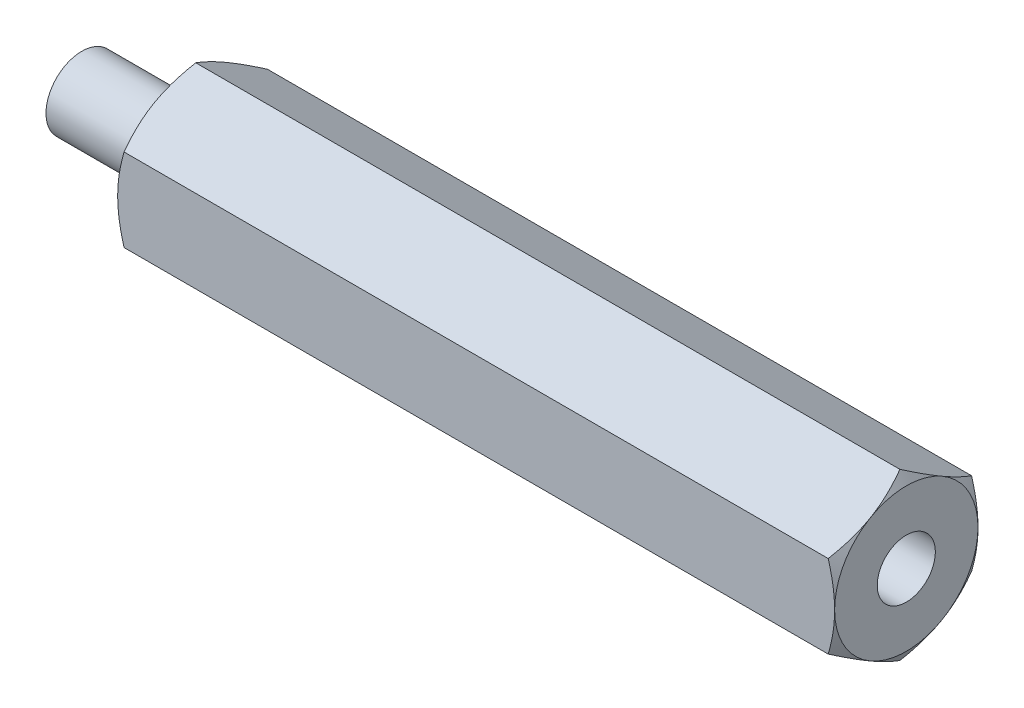
ISO-10303-21;
HEADER;
FILE_DESCRIPTION(('STEP AP214'),'2;1');
FILE_NAME('part.step','',(''),(''),'','','');
FILE_SCHEMA(('AUTOMOTIVE_DESIGN { 1 0 10303 214 1 1 1 1 }'));
ENDSEC;
DATA;
#1=APPLICATION_CONTEXT('core data for automotive mechanical design processes');
#2=APPLICATION_PROTOCOL_DEFINITION('international standard','automotive_design',2000,#1);
#3=PRODUCT_CONTEXT('',#1,'mechanical');
#4=PRODUCT('Part','Part','',(#3));
#5=PRODUCT_RELATED_PRODUCT_CATEGORY('part','',(#4));
#6=PRODUCT_DEFINITION_FORMATION('','',#4);
#7=PRODUCT_DEFINITION_CONTEXT('part definition',#1,'design');
#8=PRODUCT_DEFINITION('design','',#6,#7);
#9=PRODUCT_DEFINITION_SHAPE('','',#8);
#10=(LENGTH_UNIT() NAMED_UNIT(*) SI_UNIT(.MILLI.,.METRE.));
#11=(NAMED_UNIT(*) PLANE_ANGLE_UNIT() SI_UNIT($,.RADIAN.));
#12=(NAMED_UNIT(*) SI_UNIT($,.STERADIAN.) SOLID_ANGLE_UNIT());
#13=UNCERTAINTY_MEASURE_WITH_UNIT(LENGTH_MEASURE(1.E-05),#10,'distance_accuracy_value','');
#14=(GEOMETRIC_REPRESENTATION_CONTEXT(3) GLOBAL_UNCERTAINTY_ASSIGNED_CONTEXT((#13)) GLOBAL_UNIT_ASSIGNED_CONTEXT((#10,
#11,#12)) REPRESENTATION_CONTEXT('',''));
#15=CARTESIAN_POINT('',(0.,0.,0.));
#16=DIRECTION('',(0.,0.,1.));
#17=DIRECTION('',(1.,0.,0.));
#18=AXIS2_PLACEMENT_3D('',#15,#16,#17);
#19=CARTESIAN_POINT('',(40.,2.3094010767585,-4.));
#20=DIRECTION('',(0.,-0.866025403784439,0.5));
#21=DIRECTION('',(0.,-0.5,-0.866025403784439));
#22=AXIS2_PLACEMENT_3D('',#19,#20,#21);
#23=PLANE('',#22);
#24=CARTESIAN_POINT('',(39.6426677409252,2.30928560670467,-4.0002));
#25=CARTESIAN_POINT('',(39.7012821263517,2.41077174646171,-3.82442084967677));
#26=CARTESIAN_POINT('',(39.7545896785377,2.513133908835,-3.64712438367362));
#27=CARTESIAN_POINT('',(39.8476383292536,2.71963072479812,-3.28946140682429));
#28=CARTESIAN_POINT('',(39.8873465109703,2.82376904741904,-3.10908854102985));
#29=CARTESIAN_POINT('',(39.9491577847197,3.03075510011795,-2.75057818129721));
#30=CARTESIAN_POINT('',(39.9716722684771,3.13357098372492,-2.57249584706486));
#31=CARTESIAN_POINT('',(39.9985493768534,3.33968651028528,-2.2154932828335));
#32=CARTESIAN_POINT('',(40.0029342585731,3.44298540411434,-2.03657435035591));
#33=CARTESIAN_POINT('',(39.99380992706,3.63600352522932,-1.70225715780327));
#34=CARTESIAN_POINT('',(39.982541046012,3.72575165335064,-1.54680884001294));
#35=CARTESIAN_POINT('',(39.9468260092018,3.90466320392054,-1.23692494436495));
#36=CARTESIAN_POINT('',(39.9223676542885,3.99382600759478,-1.08249043825587));
#37=CARTESIAN_POINT('',(39.8612239350807,4.17310641015197,-0.771967672225425));
#38=CARTESIAN_POINT('',(39.8242793963451,4.26320131938131,-0.6159187119369));
#39=CARTESIAN_POINT('',(39.740429927452,4.4420474282755,-0.306148164596162));
#40=CARTESIAN_POINT('',(39.6935446977873,4.53080091904966,-0.152422609226222));
#41=CARTESIAN_POINT('',(39.6426677409252,4.61891762357084,0.000199999999999245));
#42=B_SPLINE_CURVE_WITH_KNOTS('',3,(#24,#25,#26,#27,#28,#29,#30,#31,#32,#33,#34,#35,#36,#37,#38,
#39,#40,#41),.UNSPECIFIED.,.F.,.F.,(4,2,2,2,2,2,2,2,4),(0.,0.634047835695963,1.26961969224543,
1.88946157213121,2.50854226669296,3.04757825393385,3.58711366126902,4.13861653143763,
4.68903648037742),.UNSPECIFIED.);
#43=CARTESIAN_POINT('',(39.6427344100918,2.3094010767585,-4.));
#44=VERTEX_POINT('',#43);
#45=CARTESIAN_POINT('',(40.,3.46410161513775,-2.));
#46=VERTEX_POINT('',#45);
#47=EDGE_CURVE('E331',#44,#46,#42,.T.);
#48=ORIENTED_EDGE('',*,*,#47,.F.);
#49=DIRECTION('',(-1.,0.,0.));
#50=VECTOR('',#49,1.);
#51=CARTESIAN_POINT('',(40.,2.3094010767585,-4.));
#52=LINE('',#51,#50);
#53=CARTESIAN_POINT('',(0.357265589908159,2.3094010767585,-4.));
#54=VERTEX_POINT('',#53);
#55=EDGE_CURVE('E265',#44,#54,#52,.T.);
#56=ORIENTED_EDGE('',*,*,#55,.T.);
#57=CARTESIAN_POINT('',(0.357332259074763,4.61891762357084,0.000199999999999291));
#58=CARTESIAN_POINT('',(0.29871787364828,4.51743148381381,-0.175579150323229));
#59=CARTESIAN_POINT('',(0.24541032146226,4.41506932144052,-0.352875616326382));
#60=CARTESIAN_POINT('',(0.152361670746402,4.2085725054774,-0.710538593175707));
#61=CARTESIAN_POINT('',(0.112653489029703,4.10443418285647,-0.890911458970151));
#62=CARTESIAN_POINT('',(0.0508422152802785,3.89744813015756,-1.24942181870279));
#63=CARTESIAN_POINT('',(0.0283277315228888,3.79463224655059,-1.42750415293514));
#64=CARTESIAN_POINT('',(0.00145062314658197,3.58851671999023,-1.78450671716651));
#65=CARTESIAN_POINT('',(-0.0029342585730569,3.48521782616117,-1.9634256496441));
#66=CARTESIAN_POINT('',(0.00619007293996987,3.29219970504619,-2.29774284219673));
#67=CARTESIAN_POINT('',(0.0174589539879938,3.20245157692486,-2.45319115998706));
#68=CARTESIAN_POINT('',(0.0531739907981921,3.02354002635497,-2.76307505563505));
#69=CARTESIAN_POINT('',(0.0776323457115314,2.93437722268073,-2.91750956174413));
#70=CARTESIAN_POINT('',(0.138776064919287,2.75509682012354,-3.22803232777458));
#71=CARTESIAN_POINT('',(0.17572060365486,2.6650019108942,-3.3840812880631));
#72=CARTESIAN_POINT('',(0.259570072548023,2.48615580200001,-3.69385183540384));
#73=CARTESIAN_POINT('',(0.306455302212736,2.39740231122585,-3.84757739077378));
#74=CARTESIAN_POINT('',(0.357332259074762,2.30928560670467,-4.0002));
#75=B_SPLINE_CURVE_WITH_KNOTS('',3,(#57,#58,#59,#60,#61,#62,#63,#64,#65,#66,#67,#68,#69,#70,#71,
#72,#73,#74),.UNSPECIFIED.,.F.,.F.,(4,2,2,2,2,2,2,2,4),(0.,0.634047835695965,1.26961969224543,
1.88946157213122,2.50854226669297,3.04757825393385,3.58711366126903,4.13861653143763,
4.68903648037743),.UNSPECIFIED.);
#76=CARTESIAN_POINT('',(0.,3.46410161513775,-2.));
#77=VERTEX_POINT('',#76);
#78=EDGE_CURVE('E315',#77,#54,#75,.T.);
#79=ORIENTED_EDGE('',*,*,#78,.F.);
#80=CARTESIAN_POINT('',(0.357265589908159,4.61880215351701,0.));
#81=VERTEX_POINT('',#80);
#82=EDGE_CURVE('E67',#81,#77,#75,.T.);
#83=ORIENTED_EDGE('',*,*,#82,.F.);
#84=DIRECTION('',(-1.,0.,0.));
#85=VECTOR('',#84,1.);
#86=CARTESIAN_POINT('',(40.,4.61880215351701,0.));
#87=LINE('',#86,#85);
#88=CARTESIAN_POINT('',(39.6427344100918,4.61880215351701,0.));
#89=VERTEX_POINT('',#88);
#90=EDGE_CURVE('E275',#89,#81,#87,.T.);
#91=ORIENTED_EDGE('',*,*,#90,.F.);
#92=EDGE_CURVE('E228',#46,#89,#42,.T.);
#93=ORIENTED_EDGE('',*,*,#92,.F.);
#94=EDGE_LOOP('',(#48,#56,#79,#83,#91,#93));
#95=FACE_BOUND('',#94,.T.);
#96=ADVANCED_FACE('F45',(#95),#23,.F.);
#97=CARTESIAN_POINT('',(40.,4.61880215351701,0.));
#98=DIRECTION('',(0.,-0.866025403784439,-0.5));
#99=DIRECTION('',(0.,0.5,-0.866025403784439));
#100=AXIS2_PLACEMENT_3D('',#97,#98,#99);
#101=PLANE('',#100);
#102=CARTESIAN_POINT('',(39.6426677409252,4.61891762357084,-0.0002000000000005));
#103=CARTESIAN_POINT('',(39.7012821263517,4.5174314838138,0.175579150323228));
#104=CARTESIAN_POINT('',(39.7545896785377,4.41506932144052,0.35287561632638));
#105=CARTESIAN_POINT('',(39.8476383292536,4.2085725054774,0.710538593175704));
#106=CARTESIAN_POINT('',(39.8873465109703,4.10443418285647,0.890911458970148));
#107=CARTESIAN_POINT('',(39.9491577847197,3.89744813015756,1.24942181870279));
#108=CARTESIAN_POINT('',(39.9716722684771,3.7946322465506,1.42750415293514));
#109=CARTESIAN_POINT('',(39.9985493768534,3.58851671999023,1.7845067171665));
#110=CARTESIAN_POINT('',(40.0029342585731,3.48521782616117,1.96342564964409));
#111=CARTESIAN_POINT('',(39.99380992706,3.29219970504619,2.29774284219672));
#112=CARTESIAN_POINT('',(39.982541046012,3.20245157692487,2.45319115998706));
#113=CARTESIAN_POINT('',(39.9468260092018,3.02354002635497,2.76307505563505));
#114=CARTESIAN_POINT('',(39.9223676542885,2.93437722268073,2.91750956174413));
#115=CARTESIAN_POINT('',(39.8612239350807,2.75509682012354,3.22803232777457));
#116=CARTESIAN_POINT('',(39.8242793963451,2.6650019108942,3.3840812880631));
#117=CARTESIAN_POINT('',(39.740429927452,2.48615580200001,3.69385183540384));
#118=CARTESIAN_POINT('',(39.6935446977873,2.39740231122585,3.84757739077378));
#119=CARTESIAN_POINT('',(39.6426677409252,2.30928560670467,4.0002));
#120=B_SPLINE_CURVE_WITH_KNOTS('',3,(#102,#103,#104,#105,#106,#107,#108,#109,#110,#111,#112,
#113,#114,#115,#116,#117,#118,#119),.UNSPECIFIED.,.F.,.F.,(4,2,2,2,2,2,2,2,4),(0.,
0.634047835695963,1.26961969224543,1.88946157213121,2.50854226669296,3.04757825393385,
3.58711366126903,4.13861653143763,4.68903648037743),.UNSPECIFIED.);
#121=CARTESIAN_POINT('',(40.,3.46410161513776,2.));
#122=VERTEX_POINT('',#121);
#123=EDGE_CURVE('E226',#89,#122,#120,.T.);
#124=ORIENTED_EDGE('',*,*,#123,.F.);
#125=ORIENTED_EDGE('',*,*,#90,.T.);
#126=CARTESIAN_POINT('',(0.357332259074763,2.30928560670467,4.0002));
#127=CARTESIAN_POINT('',(0.29871787364828,2.41077174646171,3.82442084967677));
#128=CARTESIAN_POINT('',(0.24541032146226,2.513133908835,3.64712438367362));
#129=CARTESIAN_POINT('',(0.152361670746402,2.71963072479812,3.28946140682429));
#130=CARTESIAN_POINT('',(0.112653489029703,2.82376904741904,3.10908854102985));
#131=CARTESIAN_POINT('',(0.0508422152802782,3.03075510011795,2.75057818129721));
#132=CARTESIAN_POINT('',(0.0283277315228886,3.13357098372492,2.57249584706486));
#133=CARTESIAN_POINT('',(0.00145062314658191,3.33968651028528,2.21549328283349));
#134=CARTESIAN_POINT('',(-0.00293425857305685,3.44298540411434,2.0365743503559));
#135=CARTESIAN_POINT('',(0.00619007293996971,3.63600352522932,1.70225715780327));
#136=CARTESIAN_POINT('',(0.0174589539879934,3.72575165335065,1.54680884001294));
#137=CARTESIAN_POINT('',(0.0531739907981919,3.90466320392054,1.23692494436495));
#138=CARTESIAN_POINT('',(0.0776323457115318,3.99382600759478,1.08249043825587));
#139=CARTESIAN_POINT('',(0.138776064919288,4.17310641015197,0.771967672225422));
#140=CARTESIAN_POINT('',(0.175720603654861,4.26320131938131,0.615918711936898));
#141=CARTESIAN_POINT('',(0.259570072548024,4.4420474282755,0.30614816459616));
#142=CARTESIAN_POINT('',(0.306455302212736,4.53080091904966,0.152422609226221));
#143=CARTESIAN_POINT('',(0.357332259074762,4.61891762357084,-0.000200000000000296));
#144=B_SPLINE_CURVE_WITH_KNOTS('',3,(#126,#127,#128,#129,#130,#131,#132,#133,#134,#135,#136,
#137,#138,#139,#140,#141,#142,#143),.UNSPECIFIED.,.F.,.F.,(4,2,2,2,2,2,2,2,4),(0.,
0.634047835695965,1.26961969224543,1.88946157213122,2.50854226669297,3.04757825393385,
3.58711366126903,4.13861653143764,4.68903648037743),.UNSPECIFIED.);
#145=CARTESIAN_POINT('',(0.,3.46410161513776,2.));
#146=VERTEX_POINT('',#145);
#147=EDGE_CURVE('E242',#146,#81,#144,.T.);
#148=ORIENTED_EDGE('',*,*,#147,.F.);
#149=CARTESIAN_POINT('',(0.357265589908159,2.3094010767585,4.));
#150=VERTEX_POINT('',#149);
#151=EDGE_CURVE('E249',#150,#146,#144,.T.);
#152=ORIENTED_EDGE('',*,*,#151,.F.);
#153=DIRECTION('',(-1.,0.,0.));
#154=VECTOR('',#153,1.);
#155=CARTESIAN_POINT('',(40.,2.3094010767585,4.));
#156=LINE('',#155,#154);
#157=CARTESIAN_POINT('',(39.6427344100918,2.3094010767585,4.));
#158=VERTEX_POINT('',#157);
#159=EDGE_CURVE('E273',#158,#150,#156,.T.);
#160=ORIENTED_EDGE('',*,*,#159,.F.);
#161=EDGE_CURVE('E221',#122,#158,#120,.T.);
#162=ORIENTED_EDGE('',*,*,#161,.F.);
#163=EDGE_LOOP('',(#124,#125,#148,#152,#160,#162));
#164=FACE_BOUND('',#163,.T.);
#165=ADVANCED_FACE('F234',(#164),#101,.F.);
#166=CARTESIAN_POINT('',(40.,2.3094010767585,4.));
#167=DIRECTION('',(0.,0.,-1.));
#168=DIRECTION('',(-1.,0.,0.));
#169=AXIS2_PLACEMENT_3D('',#166,#167,#168);
#170=PLANE('',#169);
#171=CARTESIAN_POINT('',(38.0858931787594,-6.12487198995892,4.));
#172=CARTESIAN_POINT('',(38.1707637292332,-5.94924937038676,4.));
#173=CARTESIAN_POINT('',(38.2547905961927,-5.77321152095285,4.));
#174=CARTESIAN_POINT('',(38.4206748532029,-5.42008084777954,4.));
#175=CARTESIAN_POINT('',(38.5025318676328,-5.24298784779927,4.));
#176=CARTESIAN_POINT('',(38.6640255369415,-4.88656571686333,4.));
#177=CARTESIAN_POINT('',(38.743646804937,-4.70722958889361,4.));
#178=CARTESIAN_POINT('',(38.8994694145797,-4.34708334747262,4.));
#179=CARTESIAN_POINT('',(38.975670934492,-4.16627331143536,4.));
#180=CARTESIAN_POINT('',(39.1246493496057,-3.80064706744976,4.));
#181=CARTESIAN_POINT('',(39.1973727157842,-3.61580892822769,4.));
#182=CARTESIAN_POINT('',(39.3371237690406,-3.24395246794967,4.));
#183=CARTESIAN_POINT('',(39.4041508224335,-3.056933906958,4.));
#184=CARTESIAN_POINT('',(39.5307082515691,-2.6808031825377,4.));
#185=CARTESIAN_POINT('',(39.5902545652162,-2.49169643712848,4.));
#186=CARTESIAN_POINT('',(39.6999166434555,-2.11079454635851,4.));
#187=CARTESIAN_POINT('',(39.7500353903233,-1.91900027185748,4.));
#188=CARTESIAN_POINT('',(39.838409205046,-1.532592326982,4.));
#189=CARTESIAN_POINT('',(39.8766611140435,-1.3379779203165,4.));
#190=CARTESIAN_POINT('',(39.9387257640777,-0.946402725872556,4.));
#191=CARTESIAN_POINT('',(39.9625384923483,-0.749441936019777,4.));
#192=CARTESIAN_POINT('',(39.9936181868506,-0.355451989627947,4.));
#193=CARTESIAN_POINT('',(40.000989900761,-0.158431311094017,4.));
#194=CARTESIAN_POINT('',(39.9987959336252,0.235472085607462,4.));
#195=CARTESIAN_POINT('',(39.9892346491847,0.432354826312197,4.));
#196=CARTESIAN_POINT('',(39.9591212653864,0.768560635225515,4.));
#197=CARTESIAN_POINT('',(39.9424907039561,0.908254618381824,4.));
#198=CARTESIAN_POINT('',(39.9017865896533,1.18656349063499,4.));
#199=CARTESIAN_POINT('',(39.8777118629416,1.32517820601015,4.));
#200=CARTESIAN_POINT('',(39.7955849290498,1.73929045452973,4.));
#201=CARTESIAN_POINT('',(39.7276511135748,2.01284690528727,4.));
#202=CARTESIAN_POINT('',(39.6104836406828,2.4221825301453,4.));
#203=CARTESIAN_POINT('',(39.5682860581884,2.56009536361545,4.));
#204=CARTESIAN_POINT('',(39.4797154197722,2.83448159101412,4.));
#205=CARTESIAN_POINT('',(39.4333452438131,2.97095590623566,4.));
#206=CARTESIAN_POINT('',(39.3373943008197,3.24189440516351,4.));
#207=CARTESIAN_POINT('',(39.2878330742465,3.37636557946848,4.));
#208=CARTESIAN_POINT('',(39.1858016462093,3.64426461152925,4.));
#209=CARTESIAN_POINT('',(39.1333302690366,3.77769202239399,4.));
#210=CARTESIAN_POINT('',(39.0796909934582,3.91063698986696,4.));
#211=B_SPLINE_CURVE_WITH_KNOTS('',3,(#171,#172,#173,#174,#175,#176,#177,#178,#179,#180,#181,
#182,#183,#184,#185,#186,#187,#188,#189,#190,#191,#192,#193,#194,#195,#196,#197,#198,#199,#200,
#201,#202,#203,#204,#205,#206,#207,#208,#209,#210),.UNSPECIFIED.,.F.,.F.,(4,2,2,2,2,2,2,2,2,2,2,
2,2,2,2,2,2,2,2,4),(0.,0.58517179253227,1.17044423059926,1.75906594645989,2.34765694284826,
2.94347400997483,3.53935727210688,4.13394864697598,4.72835161391469,5.32291267067842,
5.91747425310809,6.50823685854033,7.09884609659883,7.5206814082552,7.9425832713084,
8.78701491359833,9.21965281897694,9.65199437116304,10.0819024146298,10.5119854255248),.UNSPECIFIED.);
#212=CARTESIAN_POINT('',(40.,0.,4.));
#213=VERTEX_POINT('',#212);
#214=EDGE_CURVE('E227',#158,#213,#211,.F.);
#215=ORIENTED_EDGE('',*,*,#214,.F.);
#216=ORIENTED_EDGE('',*,*,#159,.T.);
#217=CARTESIAN_POINT('',(1.91410682124061,-6.12487198995891,4.));
#218=CARTESIAN_POINT('',(1.82923627076687,-5.94924937038676,4.));
#219=CARTESIAN_POINT('',(1.74520940380737,-5.77321152095285,4.));
#220=CARTESIAN_POINT('',(1.57932514679714,-5.42008084777954,4.));
#221=CARTESIAN_POINT('',(1.4974681323672,-5.24298784779927,4.));
#222=CARTESIAN_POINT('',(1.33597446305853,-4.88656571686333,4.));
#223=CARTESIAN_POINT('',(1.25635319506301,-4.70722958889361,4.));
#224=CARTESIAN_POINT('',(1.10053058542028,-4.34708334747262,4.));
#225=CARTESIAN_POINT('',(1.024329065508,-4.16627331143537,4.));
#226=CARTESIAN_POINT('',(0.875350650394345,-3.80064706744977,4.));
#227=CARTESIAN_POINT('',(0.80262728421583,-3.61580892822769,4.));
#228=CARTESIAN_POINT('',(0.662876230959407,-3.24395246794968,4.));
#229=CARTESIAN_POINT('',(0.595849177566492,-3.056933906958,4.));
#230=CARTESIAN_POINT('',(0.469291748430872,-2.6808031825377,4.));
#231=CARTESIAN_POINT('',(0.409745434783829,-2.49169643712848,4.));
#232=CARTESIAN_POINT('',(0.3000833565445,-2.1107945463585,4.));
#233=CARTESIAN_POINT('',(0.249964609676747,-1.91900027185748,4.));
#234=CARTESIAN_POINT('',(0.161590794954038,-1.53259232698199,4.));
#235=CARTESIAN_POINT('',(0.123338885956537,-1.33797792031649,4.));
#236=CARTESIAN_POINT('',(0.0612742359223418,-0.946402725872551,4.));
#237=CARTESIAN_POINT('',(0.037461507651698,-0.749441936019771,4.));
#238=CARTESIAN_POINT('',(0.00638181314943621,-0.355451989627941,4.));
#239=CARTESIAN_POINT('',(-0.000989900761041223,-0.15843131109401,4.));
#240=CARTESIAN_POINT('',(0.00120406637479575,0.235472085607469,4.));
#241=CARTESIAN_POINT('',(0.0107653508153506,0.432354826312204,4.));
#242=CARTESIAN_POINT('',(0.0408787346135905,0.768560635225518,4.));
#243=CARTESIAN_POINT('',(0.0575092960439098,0.908254618381824,4.));
#244=CARTESIAN_POINT('',(0.0982134103466922,1.18656349063498,4.));
#245=CARTESIAN_POINT('',(0.122288137058447,1.32517820601015,4.));
#246=CARTESIAN_POINT('',(0.204415070950233,1.73929045452971,4.));
#247=CARTESIAN_POINT('',(0.272348886425157,2.01284690528725,4.));
#248=CARTESIAN_POINT('',(0.389516359317209,2.42218253014527,4.));
#249=CARTESIAN_POINT('',(0.431713941811642,2.56009536361543,4.));
#250=CARTESIAN_POINT('',(0.52028458022777,2.83448159101408,4.));
#251=CARTESIAN_POINT('',(0.56665475618692,2.97095590623562,4.));
#252=CARTESIAN_POINT('',(0.662605699180296,3.24189440516346,4.));
#253=CARTESIAN_POINT('',(0.71216692575351,3.37636557946844,4.));
#254=CARTESIAN_POINT('',(0.814198353790714,3.6442646115292,4.));
#255=CARTESIAN_POINT('',(0.866669730963382,3.77769202239394,4.));
#256=CARTESIAN_POINT('',(0.920309006541806,3.91063698986691,4.));
#257=B_SPLINE_CURVE_WITH_KNOTS('',3,(#217,#218,#219,#220,#221,#222,#223,#224,#225,#226,#227,
#228,#229,#230,#231,#232,#233,#234,#235,#236,#237,#238,#239,#240,#241,#242,#243,#244,#245,#246,
#247,#248,#249,#250,#251,#252,#253,#254,#255,#256),.UNSPECIFIED.,.F.,.F.,(4,2,2,2,2,2,2,2,2,2,2,
2,2,2,2,2,2,2,2,4),(0.,0.585171792532269,1.17044423059927,1.75906594645989,2.34765694284826,
2.94347400997483,3.53935727210688,4.13394864697599,4.7283516139147,5.32291267067844,
5.91747425310811,6.50823685854035,7.09884609659885,7.5206814082552,7.9425832713084,
8.78701491359832,9.21965281897692,9.65199437116301,10.0819024146297,10.5119854255247),.UNSPECIFIED.);
#258=CARTESIAN_POINT('',(0.,0.,4.));
#259=VERTEX_POINT('',#258);
#260=EDGE_CURVE('E256',#259,#150,#257,.T.);
#261=ORIENTED_EDGE('',*,*,#260,.F.);
#262=CARTESIAN_POINT('',(0.357265589908159,-2.3094010767585,4.));
#263=VERTEX_POINT('',#262);
#264=EDGE_CURVE('E263',#263,#259,#257,.T.);
#265=ORIENTED_EDGE('',*,*,#264,.F.);
#266=DIRECTION('',(-1.,0.,0.));
#267=VECTOR('',#266,1.);
#268=CARTESIAN_POINT('',(40.,-2.3094010767585,4.));
#269=LINE('',#268,#267);
#270=CARTESIAN_POINT('',(39.6427344100918,-2.3094010767585,4.));
#271=VERTEX_POINT('',#270);
#272=EDGE_CURVE('E271',#271,#263,#269,.T.);
#273=ORIENTED_EDGE('',*,*,#272,.F.);
#274=EDGE_CURVE('E214',#213,#271,#211,.F.);
#275=ORIENTED_EDGE('',*,*,#274,.F.);
#276=EDGE_LOOP('',(#215,#216,#261,#265,#273,#275));
#277=FACE_BOUND('',#276,.T.);
#278=ADVANCED_FACE('F237',(#277),#170,.F.);
#279=CARTESIAN_POINT('',(40.,-2.3094010767585,4.));
#280=DIRECTION('',(0.,0.866025403784439,-0.5));
#281=DIRECTION('',(0.,0.5,0.866025403784439));
#282=AXIS2_PLACEMENT_3D('',#279,#280,#281);
#283=PLANE('',#282);
#284=CARTESIAN_POINT('',(39.6426677409252,-2.30928560670466,4.0002));
#285=CARTESIAN_POINT('',(39.7012821263517,-2.4107717464617,3.82442084967677));
#286=CARTESIAN_POINT('',(39.7545896785377,-2.51313390883499,3.64712438367362));
#287=CARTESIAN_POINT('',(39.8476383292536,-2.71963072479811,3.28946140682429));
#288=CARTESIAN_POINT('',(39.8873465109703,-2.82376904741904,3.10908854102985));
#289=CARTESIAN_POINT('',(39.9491577847197,-3.03075510011795,2.75057818129721));
#290=CARTESIAN_POINT('',(39.9716722684771,-3.13357098372491,2.57249584706486));
#291=CARTESIAN_POINT('',(39.9985493768534,-3.33968651028528,2.2154932828335));
#292=CARTESIAN_POINT('',(40.0029342585731,-3.44298540411434,2.03657435035591));
#293=CARTESIAN_POINT('',(39.99380992706,-3.63600352522932,1.70225715780327));
#294=CARTESIAN_POINT('',(39.982541046012,-3.72575165335064,1.54680884001294));
#295=CARTESIAN_POINT('',(39.9468260092018,-3.90466320392054,1.23692494436495));
#296=CARTESIAN_POINT('',(39.9223676542885,-3.99382600759478,1.08249043825587));
#297=CARTESIAN_POINT('',(39.8612239350807,-4.17310641015197,0.771967672225425));
#298=CARTESIAN_POINT('',(39.8242793963451,-4.26320131938131,0.6159187119369));
#299=CARTESIAN_POINT('',(39.740429927452,-4.4420474282755,0.306148164596161));
#300=CARTESIAN_POINT('',(39.6935446977873,-4.53080091904966,0.152422609226221));
#301=CARTESIAN_POINT('',(39.6426677409252,-4.61891762357084,-0.000199999999999952));
#302=B_SPLINE_CURVE_WITH_KNOTS('',3,(#284,#285,#286,#287,#288,#289,#290,#291,#292,#293,#294,
#295,#296,#297,#298,#299,#300,#301),.UNSPECIFIED.,.F.,.F.,(4,2,2,2,2,2,2,2,4),(0.,
0.634047835695964,1.26961969224543,1.88946157213121,2.50854226669296,3.04757825393385,
3.58711366126903,4.13861653143763,4.68903648037743),.UNSPECIFIED.);
#303=CARTESIAN_POINT('',(40.,-3.46410161513775,2.));
#304=VERTEX_POINT('',#303);
#305=EDGE_CURVE('E380',#271,#304,#302,.T.);
#306=ORIENTED_EDGE('',*,*,#305,.F.);
#307=ORIENTED_EDGE('',*,*,#272,.T.);
#308=CARTESIAN_POINT('',(0.357332259074763,-4.61891762357084,-0.000199999999999954));
#309=CARTESIAN_POINT('',(0.298717873648278,-4.5174314838138,0.175579150323228));
#310=CARTESIAN_POINT('',(0.245410321462259,-4.41506932144052,0.35287561632638));
#311=CARTESIAN_POINT('',(0.152361670746401,-4.20857250547739,0.710538593175705));
#312=CARTESIAN_POINT('',(0.112653489029703,-4.10443418285647,0.89091145897015));
#313=CARTESIAN_POINT('',(0.050842215280278,-3.89744813015756,1.24942181870279));
#314=CARTESIAN_POINT('',(0.0283277315228878,-3.79463224655059,1.42750415293514));
#315=CARTESIAN_POINT('',(0.00145062314658099,-3.58851671999023,1.78450671716651));
#316=CARTESIAN_POINT('',(-0.00293425857305737,-3.48521782616117,1.9634256496441));
#317=CARTESIAN_POINT('',(0.00619007293996937,-3.29219970504619,2.29774284219673));
#318=CARTESIAN_POINT('',(0.0174589539879929,-3.20245157692486,2.45319115998706));
#319=CARTESIAN_POINT('',(0.0531739907981911,-3.02354002635497,2.76307505563505));
#320=CARTESIAN_POINT('',(0.0776323457115307,-2.93437722268072,2.91750956174413));
#321=CARTESIAN_POINT('',(0.138776064919286,-2.75509682012354,3.22803232777458));
#322=CARTESIAN_POINT('',(0.17572060365486,-2.6650019108942,3.3840812880631));
#323=CARTESIAN_POINT('',(0.259570072548023,-2.48615580200001,3.69385183540384));
#324=CARTESIAN_POINT('',(0.306455302212736,-2.39740231122585,3.84757739077378));
#325=CARTESIAN_POINT('',(0.357332259074762,-2.30928560670466,4.0002));
#326=B_SPLINE_CURVE_WITH_KNOTS('',3,(#308,#309,#310,#311,#312,#313,#314,#315,#316,#317,#318,
#319,#320,#321,#322,#323,#324,#325),.UNSPECIFIED.,.F.,.F.,(4,2,2,2,2,2,2,2,4),(0.,
0.634047835695965,1.26961969224543,1.88946157213122,2.50854226669297,3.04757825393385,
3.58711366126903,4.13861653143764,4.68903648037743),.UNSPECIFIED.);
#327=CARTESIAN_POINT('',(0.,-3.46410161513775,2.));
#328=VERTEX_POINT('',#327);
#329=EDGE_CURVE('E264',#328,#263,#326,.T.);
#330=ORIENTED_EDGE('',*,*,#329,.F.);
#331=CARTESIAN_POINT('',(0.357265589908159,-4.61880215351701,0.));
#332=VERTEX_POINT('',#331);
#333=EDGE_CURVE('E250',#332,#328,#326,.T.);
#334=ORIENTED_EDGE('',*,*,#333,.F.);
#335=DIRECTION('',(-1.,0.,0.));
#336=VECTOR('',#335,1.);
#337=CARTESIAN_POINT('',(40.,-4.61880215351701,0.));
#338=LINE('',#337,#336);
#339=CARTESIAN_POINT('',(39.6427344100918,-4.61880215351701,0.));
#340=VERTEX_POINT('',#339);
#341=EDGE_CURVE('E269',#340,#332,#338,.T.);
#342=ORIENTED_EDGE('',*,*,#341,.F.);
#343=EDGE_CURVE('E207',#304,#340,#302,.T.);
#344=ORIENTED_EDGE('',*,*,#343,.F.);
#345=EDGE_LOOP('',(#306,#307,#330,#334,#342,#344));
#346=FACE_BOUND('',#345,.T.);
#347=ADVANCED_FACE('F309',(#346),#283,.F.);
#348=CARTESIAN_POINT('',(40.,-4.61880215351701,0.));
#349=DIRECTION('',(0.,0.866025403784439,0.5));
#350=DIRECTION('',(0.,-0.5,0.866025403784439));
#351=AXIS2_PLACEMENT_3D('',#348,#349,#350);
#352=PLANE('',#351);
#353=CARTESIAN_POINT('',(39.6426677409252,-4.61891762357084,0.000199999999999928));
#354=CARTESIAN_POINT('',(39.7012821263517,-4.5174314838138,-0.175579150323229));
#355=CARTESIAN_POINT('',(39.7545896785377,-4.41506932144052,-0.352875616326381));
#356=CARTESIAN_POINT('',(39.8476383292536,-4.2085725054774,-0.710538593175704));
#357=CARTESIAN_POINT('',(39.8873465109703,-4.10443418285647,-0.890911458970147));
#358=CARTESIAN_POINT('',(39.9491577847197,-3.89744813015756,-1.24942181870279));
#359=CARTESIAN_POINT('',(39.9716722684771,-3.7946322465506,-1.42750415293514));
#360=CARTESIAN_POINT('',(39.9985493768534,-3.58851671999023,-1.7845067171665));
#361=CARTESIAN_POINT('',(40.0029342585731,-3.48521782616117,-1.96342564964409));
#362=CARTESIAN_POINT('',(39.99380992706,-3.29219970504619,-2.29774284219672));
#363=CARTESIAN_POINT('',(39.982541046012,-3.20245157692487,-2.45319115998706));
#364=CARTESIAN_POINT('',(39.9468260092018,-3.02354002635497,-2.76307505563505));
#365=CARTESIAN_POINT('',(39.9223676542885,-2.93437722268073,-2.91750956174412));
#366=CARTESIAN_POINT('',(39.8612239350807,-2.75509682012354,-3.22803232777457));
#367=CARTESIAN_POINT('',(39.8242793963451,-2.6650019108942,-3.3840812880631));
#368=CARTESIAN_POINT('',(39.740429927452,-2.48615580200001,-3.69385183540384));
#369=CARTESIAN_POINT('',(39.6935446977873,-2.39740231122585,-3.84757739077378));
#370=CARTESIAN_POINT('',(39.6426677409252,-2.30928560670467,-4.0002));
#371=B_SPLINE_CURVE_WITH_KNOTS('',3,(#353,#354,#355,#356,#357,#358,#359,#360,#361,#362,#363,
#364,#365,#366,#367,#368,#369,#370),.UNSPECIFIED.,.F.,.F.,(4,2,2,2,2,2,2,2,4),(0.,
0.634047835695963,1.26961969224543,1.88946157213121,2.50854226669296,3.04757825393385,
3.58711366126902,4.13861653143763,4.68903648037743),.UNSPECIFIED.);
#372=CARTESIAN_POINT('',(40.,-3.46410161513776,-2.));
#373=VERTEX_POINT('',#372);
#374=EDGE_CURVE('E378',#340,#373,#371,.T.);
#375=ORIENTED_EDGE('',*,*,#374,.F.);
#376=ORIENTED_EDGE('',*,*,#341,.T.);
#377=CARTESIAN_POINT('',(0.357332259074763,-2.30928560670467,-4.0002));
#378=CARTESIAN_POINT('',(0.298717873648279,-2.41077174646171,-3.82442084967677));
#379=CARTESIAN_POINT('',(0.24541032146226,-2.513133908835,-3.64712438367362));
#380=CARTESIAN_POINT('',(0.152361670746402,-2.71963072479812,-3.28946140682429));
#381=CARTESIAN_POINT('',(0.112653489029702,-2.82376904741904,-3.10908854102985));
#382=CARTESIAN_POINT('',(0.0508422152802781,-3.03075510011795,-2.75057818129721));
#383=CARTESIAN_POINT('',(0.0283277315228886,-3.13357098372492,-2.57249584706486));
#384=CARTESIAN_POINT('',(0.00145062314658193,-3.33968651028528,-2.21549328283349));
#385=CARTESIAN_POINT('',(-0.00293425857305696,-3.44298540411434,-2.0365743503559));
#386=CARTESIAN_POINT('',(0.0061900729399697,-3.63600352522932,-1.70225715780327));
#387=CARTESIAN_POINT('',(0.0174589539879936,-3.72575165335065,-1.54680884001294));
#388=CARTESIAN_POINT('',(0.0531739907981921,-3.90466320392054,-1.23692494436495));
#389=CARTESIAN_POINT('',(0.0776323457115317,-3.99382600759478,-1.08249043825587));
#390=CARTESIAN_POINT('',(0.138776064919287,-4.17310641015197,-0.771967672225423));
#391=CARTESIAN_POINT('',(0.175720603654861,-4.26320131938131,-0.615918711936899));
#392=CARTESIAN_POINT('',(0.259570072548023,-4.4420474282755,-0.306148164596161));
#393=CARTESIAN_POINT('',(0.306455302212736,-4.53080091904966,-0.152422609226221));
#394=CARTESIAN_POINT('',(0.357332259074762,-4.61891762357084,0.000199999999999635));
#395=B_SPLINE_CURVE_WITH_KNOTS('',3,(#377,#378,#379,#380,#381,#382,#383,#384,#385,#386,#387,
#388,#389,#390,#391,#392,#393,#394),.UNSPECIFIED.,.F.,.F.,(4,2,2,2,2,2,2,2,4),(0.,
0.634047835695965,1.26961969224543,1.88946157213122,2.50854226669297,3.04757825393385,
3.58711366126903,4.13861653143763,4.68903648037743),.UNSPECIFIED.);
#396=CARTESIAN_POINT('',(0.,-3.46410161513776,-2.));
#397=VERTEX_POINT('',#396);
#398=EDGE_CURVE('E312',#397,#332,#395,.T.);
#399=ORIENTED_EDGE('',*,*,#398,.F.);
#400=CARTESIAN_POINT('',(0.357265589908159,-2.3094010767585,-4.));
#401=VERTEX_POINT('',#400);
#402=EDGE_CURVE('E314',#401,#397,#395,.T.);
#403=ORIENTED_EDGE('',*,*,#402,.F.);
#404=DIRECTION('',(-1.,0.,0.));
#405=VECTOR('',#404,1.);
#406=CARTESIAN_POINT('',(40.,-2.3094010767585,-4.));
#407=LINE('',#406,#405);
#408=CARTESIAN_POINT('',(39.6427344100918,-2.3094010767585,-4.));
#409=VERTEX_POINT('',#408);
#410=EDGE_CURVE('E267',#409,#401,#407,.T.);
#411=ORIENTED_EDGE('',*,*,#410,.F.);
#412=EDGE_CURVE('E177',#373,#409,#371,.T.);
#413=ORIENTED_EDGE('',*,*,#412,.F.);
#414=EDGE_LOOP('',(#375,#376,#399,#403,#411,#413));
#415=FACE_BOUND('',#414,.T.);
#416=ADVANCED_FACE('F376',(#415),#352,.F.);
#417=CARTESIAN_POINT('',(40.,-2.3094010767585,-4.));
#418=DIRECTION('',(0.,0.,1.));
#419=DIRECTION('',(1.,0.,0.));
#420=AXIS2_PLACEMENT_3D('',#417,#418,#419);
#421=PLANE('',#420);
#422=CARTESIAN_POINT('',(38.0858931787594,-6.12487198995892,-4.));
#423=CARTESIAN_POINT('',(38.1707637292332,-5.94924937038676,-4.));
#424=CARTESIAN_POINT('',(38.2547905961927,-5.77321152095286,-4.));
#425=CARTESIAN_POINT('',(38.4206748532029,-5.42008084777954,-4.));
#426=CARTESIAN_POINT('',(38.5025318676328,-5.24298784779927,-4.));
#427=CARTESIAN_POINT('',(38.6640255369415,-4.88656571686333,-4.));
#428=CARTESIAN_POINT('',(38.743646804937,-4.70722958889362,-4.));
#429=CARTESIAN_POINT('',(38.8994694145797,-4.34708334747263,-4.));
#430=CARTESIAN_POINT('',(38.975670934492,-4.16627331143537,-4.));
#431=CARTESIAN_POINT('',(39.1246493496057,-3.80064706744977,-4.));
#432=CARTESIAN_POINT('',(39.1973727157842,-3.61580892822769,-4.));
#433=CARTESIAN_POINT('',(39.3371237690406,-3.24395246794968,-4.));
#434=CARTESIAN_POINT('',(39.4041508224335,-3.05693390695801,-4.));
#435=CARTESIAN_POINT('',(39.5307082515691,-2.6808031825377,-4.));
#436=CARTESIAN_POINT('',(39.5902545652162,-2.49169643712848,-4.));
#437=CARTESIAN_POINT('',(39.6999166434555,-2.11079454635851,-4.));
#438=CARTESIAN_POINT('',(39.7500353903233,-1.91900027185749,-4.));
#439=CARTESIAN_POINT('',(39.838409205046,-1.532592326982,-4.));
#440=CARTESIAN_POINT('',(39.8766611140435,-1.3379779203165,-4.));
#441=CARTESIAN_POINT('',(39.9387257640777,-0.946402725872557,-4.));
#442=CARTESIAN_POINT('',(39.9625384923483,-0.749441936019778,-4.));
#443=CARTESIAN_POINT('',(39.9936181868506,-0.355451989627949,-4.));
#444=CARTESIAN_POINT('',(40.000989900761,-0.158431311094019,-4.));
#445=CARTESIAN_POINT('',(39.9987959336252,0.235472085607459,-4.));
#446=CARTESIAN_POINT('',(39.9892346491847,0.432354826312195,-4.));
#447=CARTESIAN_POINT('',(39.9591212653864,0.768560635225511,-4.));
#448=CARTESIAN_POINT('',(39.9424907039561,0.908254618381819,-4.));
#449=CARTESIAN_POINT('',(39.9017865896533,1.18656349063498,-4.));
#450=CARTESIAN_POINT('',(39.8777118629416,1.32517820601015,-4.));
#451=CARTESIAN_POINT('',(39.7955849290498,1.73929045452973,-4.));
#452=CARTESIAN_POINT('',(39.7276511135748,2.01284690528727,-4.));
#453=CARTESIAN_POINT('',(39.6104836406828,2.4221825301453,-4.));
#454=CARTESIAN_POINT('',(39.5682860581884,2.56009536361545,-4.));
#455=CARTESIAN_POINT('',(39.4797154197722,2.83448159101412,-4.));
#456=CARTESIAN_POINT('',(39.4333452438131,2.97095590623566,-4.));
#457=CARTESIAN_POINT('',(39.3373943008197,3.2418944051635,-4.));
#458=CARTESIAN_POINT('',(39.2878330742465,3.37636557946848,-4.));
#459=CARTESIAN_POINT('',(39.1858016462093,3.64426461152925,-4.));
#460=CARTESIAN_POINT('',(39.1333302690366,3.77769202239399,-4.));
#461=CARTESIAN_POINT('',(39.0796909934582,3.91063698986696,-4.));
#462=B_SPLINE_CURVE_WITH_KNOTS('',3,(#422,#423,#424,#425,#426,#427,#428,#429,#430,#431,#432,
#433,#434,#435,#436,#437,#438,#439,#440,#441,#442,#443,#444,#445,#446,#447,#448,#449,#450,#451,
#452,#453,#454,#455,#456,#457,#458,#459,#460,#461),.UNSPECIFIED.,.F.,.F.,(4,2,2,2,2,2,2,2,2,2,2,
2,2,2,2,2,2,2,2,4),(0.,0.585171792532268,1.17044423059926,1.75906594645989,2.34765694284826,
2.94347400997482,3.53935727210687,4.13394864697599,4.72835161391469,5.32291267067842,
5.9174742531081,6.50823685854033,7.09884609659883,7.52068140825519,7.94258327130839,
8.78701491359833,9.21965281897694,9.65199437116304,10.0819024146298,10.5119854255248),.UNSPECIFIED.);
#463=CARTESIAN_POINT('',(40.,0.,-4.));
#464=VERTEX_POINT('',#463);
#465=EDGE_CURVE('E176',#409,#464,#462,.T.);
#466=ORIENTED_EDGE('',*,*,#465,.F.);
#467=ORIENTED_EDGE('',*,*,#410,.T.);
#468=CARTESIAN_POINT('',(1.91410682124061,-6.12487198995892,-4.));
#469=CARTESIAN_POINT('',(1.82923627076687,-5.94924937038676,-4.));
#470=CARTESIAN_POINT('',(1.74520940380737,-5.77321152095286,-4.));
#471=CARTESIAN_POINT('',(1.57932514679714,-5.42008084777954,-4.));
#472=CARTESIAN_POINT('',(1.4974681323672,-5.24298784779927,-4.));
#473=CARTESIAN_POINT('',(1.33597446305853,-4.88656571686333,-4.));
#474=CARTESIAN_POINT('',(1.25635319506301,-4.70722958889362,-4.));
#475=CARTESIAN_POINT('',(1.10053058542028,-4.34708334747263,-4.));
#476=CARTESIAN_POINT('',(1.024329065508,-4.16627331143537,-4.));
#477=CARTESIAN_POINT('',(0.875350650394345,-3.80064706744977,-4.));
#478=CARTESIAN_POINT('',(0.80262728421583,-3.61580892822769,-4.));
#479=CARTESIAN_POINT('',(0.662876230959407,-3.24395246794968,-4.));
#480=CARTESIAN_POINT('',(0.595849177566492,-3.05693390695801,-4.));
#481=CARTESIAN_POINT('',(0.469291748430872,-2.6808031825377,-4.));
#482=CARTESIAN_POINT('',(0.409745434783829,-2.49169643712848,-4.));
#483=CARTESIAN_POINT('',(0.3000833565445,-2.11079454635851,-4.));
#484=CARTESIAN_POINT('',(0.249964609676746,-1.91900027185748,-4.));
#485=CARTESIAN_POINT('',(0.161590794954038,-1.532592326982,-4.));
#486=CARTESIAN_POINT('',(0.123338885956537,-1.33797792031649,-4.));
#487=CARTESIAN_POINT('',(0.0612742359223417,-0.946402725872553,-4.));
#488=CARTESIAN_POINT('',(0.0374615076516976,-0.749441936019774,-4.));
#489=CARTESIAN_POINT('',(0.0063818131494356,-0.355451989627944,-4.));
#490=CARTESIAN_POINT('',(-0.00098990076104179,-0.158431311094013,-4.));
#491=CARTESIAN_POINT('',(0.00120406637479531,0.235472085607466,-4.));
#492=CARTESIAN_POINT('',(0.0107653508153503,0.432354826312202,-4.));
#493=CARTESIAN_POINT('',(0.0408787346135898,0.768560635225516,-4.));
#494=CARTESIAN_POINT('',(0.0575092960439089,0.908254618381821,-4.));
#495=CARTESIAN_POINT('',(0.0982134103466911,1.18656349063498,-4.));
#496=CARTESIAN_POINT('',(0.122288137058446,1.32517820601014,-4.));
#497=CARTESIAN_POINT('',(0.204415070950231,1.73929045452971,-4.));
#498=CARTESIAN_POINT('',(0.272348886425155,2.01284690528725,-4.));
#499=CARTESIAN_POINT('',(0.389516359317207,2.42218253014527,-4.));
#500=CARTESIAN_POINT('',(0.431713941811641,2.56009536361542,-4.));
#501=CARTESIAN_POINT('',(0.520284580227768,2.83448159101408,-4.));
#502=CARTESIAN_POINT('',(0.566654756186919,2.97095590623562,-4.));
#503=CARTESIAN_POINT('',(0.662605699180294,3.24189440516346,-4.));
#504=CARTESIAN_POINT('',(0.712166925753509,3.37636557946843,-4.));
#505=CARTESIAN_POINT('',(0.814198353790712,3.6442646115292,-4.));
#506=CARTESIAN_POINT('',(0.86666973096338,3.77769202239393,-4.));
#507=CARTESIAN_POINT('',(0.920309006541804,3.91063698986691,-4.));
#508=B_SPLINE_CURVE_WITH_KNOTS('',3,(#468,#469,#470,#471,#472,#473,#474,#475,#476,#477,#478,
#479,#480,#481,#482,#483,#484,#485,#486,#487,#488,#489,#490,#491,#492,#493,#494,#495,#496,#497,
#498,#499,#500,#501,#502,#503,#504,#505,#506,#507),.UNSPECIFIED.,.F.,.F.,(4,2,2,2,2,2,2,2,2,2,2,
2,2,2,2,2,2,2,2,4),(0.,0.585171792532269,1.17044423059927,1.75906594645989,2.34765694284826,
2.94347400997483,3.53935727210688,4.13394864697599,4.7283516139147,5.32291267067844,
5.91747425310811,6.50823685854035,7.09884609659885,7.5206814082552,7.94258327130839,
8.78701491359831,9.21965281897692,9.65199437116301,10.0819024146297,10.5119854255247),.UNSPECIFIED.);
#509=CARTESIAN_POINT('',(0.,0.,-4.));
#510=VERTEX_POINT('',#509);
#511=EDGE_CURVE('E323',#510,#401,#508,.F.);
#512=ORIENTED_EDGE('',*,*,#511,.F.);
#513=EDGE_CURVE('E321',#54,#510,#508,.F.);
#514=ORIENTED_EDGE('',*,*,#513,.F.);
#515=ORIENTED_EDGE('',*,*,#55,.F.);
#516=EDGE_CURVE('E168',#464,#44,#462,.T.);
#517=ORIENTED_EDGE('',*,*,#516,.F.);
#518=EDGE_LOOP('',(#466,#467,#512,#514,#515,#517));
#519=FACE_BOUND('',#518,.T.);
#520=ADVANCED_FACE('F184',(#519),#421,.F.);
#521=CARTESIAN_POINT('',(0.,0.,0.));
#522=DIRECTION('',(1.,0.,0.));
#523=DIRECTION('',(0.,0.,-1.));
#524=AXIS2_PLACEMENT_3D('',#521,#522,#523);
#525=CONICAL_SURFACE('',#524,4.,1.0471975511966);
#526=ORIENTED_EDGE('',*,*,#402,.T.);
#527=CARTESIAN_POINT('',(0.,0.,0.));
#528=DIRECTION('',(1.,0.,0.));
#529=DIRECTION('',(0.,0.,-1.));
#530=AXIS2_PLACEMENT_3D('',#527,#528,#529);
#531=CIRCLE('',#530,4.);
#532=EDGE_CURVE('E276',#397,#510,#531,.T.);
#533=ORIENTED_EDGE('',*,*,#532,.T.);
#534=ORIENTED_EDGE('',*,*,#511,.T.);
#535=EDGE_LOOP('',(#526,#533,#534));
#536=FACE_BOUND('',#535,.T.);
#537=ADVANCED_FACE('F363',(#536),#525,.T.);
#538=ORIENTED_EDGE('',*,*,#333,.T.);
#539=EDGE_CURVE('E278',#328,#397,#531,.T.);
#540=ORIENTED_EDGE('',*,*,#539,.T.);
#541=ORIENTED_EDGE('',*,*,#398,.T.);
#542=EDGE_LOOP('',(#538,#540,#541));
#543=FACE_BOUND('',#542,.T.);
#544=ADVANCED_FACE('F362',(#543),#525,.T.);
#545=ORIENTED_EDGE('',*,*,#264,.T.);
#546=EDGE_CURVE('E285',#259,#328,#531,.T.);
#547=ORIENTED_EDGE('',*,*,#546,.T.);
#548=ORIENTED_EDGE('',*,*,#329,.T.);
#549=EDGE_LOOP('',(#545,#547,#548));
#550=FACE_BOUND('',#549,.T.);
#551=ADVANCED_FACE('F198',(#550),#525,.T.);
#552=ORIENTED_EDGE('',*,*,#260,.T.);
#553=ORIENTED_EDGE('',*,*,#151,.T.);
#554=CARTESIAN_POINT('',(0.,0.,0.));
#555=DIRECTION('',(-1.,0.,0.));
#556=DIRECTION('',(0.,0.,1.));
#557=AXIS2_PLACEMENT_3D('',#554,#555,#556);
#558=CIRCLE('',#557,4.);
#559=EDGE_CURVE('E326',#259,#146,#558,.T.);
#560=ORIENTED_EDGE('',*,*,#559,.F.);
#561=EDGE_LOOP('',(#552,#553,#560));
#562=FACE_BOUND('',#561,.T.);
#563=ADVANCED_FACE('F354',(#562),#525,.T.);
#564=ORIENTED_EDGE('',*,*,#147,.T.);
#565=ORIENTED_EDGE('',*,*,#82,.T.);
#566=EDGE_CURVE('E286',#77,#146,#531,.T.);
#567=ORIENTED_EDGE('',*,*,#566,.T.);
#568=EDGE_LOOP('',(#564,#565,#567));
#569=FACE_BOUND('',#568,.T.);
#570=ADVANCED_FACE('F356',(#569),#525,.T.);
#571=ORIENTED_EDGE('',*,*,#78,.T.);
#572=ORIENTED_EDGE('',*,*,#513,.T.);
#573=EDGE_CURVE('E279',#510,#77,#531,.T.);
#574=ORIENTED_EDGE('',*,*,#573,.T.);
#575=EDGE_LOOP('',(#571,#572,#574));
#576=FACE_BOUND('',#575,.T.);
#577=ADVANCED_FACE('F361',(#576),#525,.T.);
#578=CARTESIAN_POINT('',(0.,0.,0.));
#579=DIRECTION('',(1.,0.,0.));
#580=DIRECTION('',(0.,0.,-1.));
#581=AXIS2_PLACEMENT_3D('',#578,#579,#580);
#582=PLANE('',#581);
#583=CARTESIAN_POINT('',(0.,0.,0.));
#584=DIRECTION('',(1.,0.,0.));
#585=DIRECTION('',(0.,1.,0.));
#586=AXIS2_PLACEMENT_3D('',#583,#584,#585);
#587=CIRCLE('',#586,1.6);
#588=CARTESIAN_POINT('',(0.,1.6,0.));
#589=VERTEX_POINT('',#588);
#590=EDGE_CURVE('E162',#589,#589,#587,.T.);
#591=ORIENTED_EDGE('',*,*,#590,.T.);
#592=EDGE_LOOP('',(#591));
#593=FACE_BOUND('',#592,.T.);
#594=ORIENTED_EDGE('',*,*,#573,.F.);
#595=ORIENTED_EDGE('',*,*,#532,.F.);
#596=ORIENTED_EDGE('',*,*,#539,.F.);
#597=ORIENTED_EDGE('',*,*,#546,.F.);
#598=ORIENTED_EDGE('',*,*,#559,.T.);
#599=ORIENTED_EDGE('',*,*,#566,.F.);
#600=EDGE_LOOP('',(#594,#595,#596,#597,#598,#599));
#601=FACE_BOUND('',#600,.T.);
#602=ADVANCED_FACE('F302',(#593,#601),#582,.F.);
#603=CARTESIAN_POINT('',(39.6427344100918,0.,0.));
#604=DIRECTION('',(-1.,0.,0.));
#605=DIRECTION('',(0.,0.,1.));
#606=AXIS2_PLACEMENT_3D('',#603,#604,#605);
#607=CONICAL_SURFACE('',#606,4.61880215351701,1.04719755119661);
#608=ORIENTED_EDGE('',*,*,#412,.T.);
#609=ORIENTED_EDGE('',*,*,#465,.T.);
#610=CARTESIAN_POINT('',(40.,0.,0.));
#611=DIRECTION('',(1.,0.,0.));
#612=DIRECTION('',(0.,0.,-1.));
#613=AXIS2_PLACEMENT_3D('',#610,#611,#612);
#614=CIRCLE('',#613,4.);
#615=EDGE_CURVE('E49',#373,#464,#614,.T.);
#616=ORIENTED_EDGE('',*,*,#615,.F.);
#617=EDGE_LOOP('',(#608,#609,#616));
#618=FACE_BOUND('',#617,.T.);
#619=ADVANCED_FACE('F195',(#618),#607,.T.);
#620=ORIENTED_EDGE('',*,*,#343,.T.);
#621=ORIENTED_EDGE('',*,*,#374,.T.);
#622=EDGE_CURVE('E290',#304,#373,#614,.T.);
#623=ORIENTED_EDGE('',*,*,#622,.F.);
#624=EDGE_LOOP('',(#620,#621,#623));
#625=FACE_BOUND('',#624,.T.);
#626=ADVANCED_FACE('F384',(#625),#607,.T.);
#627=ORIENTED_EDGE('',*,*,#274,.T.);
#628=ORIENTED_EDGE('',*,*,#305,.T.);
#629=EDGE_CURVE('E349',#213,#304,#614,.T.);
#630=ORIENTED_EDGE('',*,*,#629,.F.);
#631=EDGE_LOOP('',(#627,#628,#630));
#632=FACE_BOUND('',#631,.T.);
#633=ADVANCED_FACE('F386',(#632),#607,.T.);
#634=ORIENTED_EDGE('',*,*,#161,.T.);
#635=ORIENTED_EDGE('',*,*,#214,.T.);
#636=CARTESIAN_POINT('',(40.,0.,0.));
#637=DIRECTION('',(-1.,0.,0.));
#638=DIRECTION('',(0.,0.,1.));
#639=AXIS2_PLACEMENT_3D('',#636,#637,#638);
#640=CIRCLE('',#639,4.);
#641=EDGE_CURVE('E165',#213,#122,#640,.T.);
#642=ORIENTED_EDGE('',*,*,#641,.T.);
#643=EDGE_LOOP('',(#634,#635,#642));
#644=FACE_BOUND('',#643,.T.);
#645=ADVANCED_FACE('F344',(#644),#607,.T.);
#646=ORIENTED_EDGE('',*,*,#92,.T.);
#647=ORIENTED_EDGE('',*,*,#123,.T.);
#648=EDGE_CURVE('E54',#46,#122,#614,.T.);
#649=ORIENTED_EDGE('',*,*,#648,.F.);
#650=EDGE_LOOP('',(#646,#647,#649));
#651=FACE_BOUND('',#650,.T.);
#652=ADVANCED_FACE('F193',(#651),#607,.T.);
#653=ORIENTED_EDGE('',*,*,#47,.T.);
#654=EDGE_CURVE('E11',#464,#46,#614,.T.);
#655=ORIENTED_EDGE('',*,*,#654,.F.);
#656=ORIENTED_EDGE('',*,*,#516,.T.);
#657=EDGE_LOOP('',(#653,#655,#656));
#658=FACE_BOUND('',#657,.T.);
#659=ADVANCED_FACE('F187',(#658),#607,.T.);
#660=CARTESIAN_POINT('',(40.,0.,0.));
#661=DIRECTION('',(1.,0.,0.));
#662=DIRECTION('',(0.,0.,-1.));
#663=AXIS2_PLACEMENT_3D('',#660,#661,#662);
#664=PLANE('',#663);
#665=CARTESIAN_POINT('',(40.,0.,0.));
#666=DIRECTION('',(1.,0.,0.));
#667=DIRECTION('',(0.,0.,-1.));
#668=AXIS2_PLACEMENT_3D('',#665,#666,#667);
#669=CIRCLE('',#668,1.621);
#670=CARTESIAN_POINT('',(40.,0.,-1.621));
#671=VERTEX_POINT('',#670);
#672=EDGE_CURVE('E149',#671,#671,#669,.T.);
#673=ORIENTED_EDGE('',*,*,#672,.F.);
#674=EDGE_LOOP('',(#673));
#675=FACE_BOUND('',#674,.T.);
#676=ORIENTED_EDGE('',*,*,#615,.T.);
#677=ORIENTED_EDGE('',*,*,#654,.T.);
#678=ORIENTED_EDGE('',*,*,#648,.T.);
#679=ORIENTED_EDGE('',*,*,#641,.F.);
#680=ORIENTED_EDGE('',*,*,#629,.T.);
#681=ORIENTED_EDGE('',*,*,#622,.T.);
#682=EDGE_LOOP('',(#676,#677,#678,#679,#680,#681));
#683=FACE_BOUND('',#682,.T.);
#684=ADVANCED_FACE('F192',(#675,#683),#664,.T.);
#685=CARTESIAN_POINT('',(0.,0.,0.));
#686=DIRECTION('',(1.,0.,0.));
#687=DIRECTION('',(0.,1.,0.));
#688=AXIS2_PLACEMENT_3D('',#685,#686,#687);
#689=CYLINDRICAL_SURFACE('',#688,1.6);
#690=CARTESIAN_POINT('',(-1.2,0.,0.));
#691=DIRECTION('',(1.,0.,0.));
#692=DIRECTION('',(0.,1.,0.));
#693=AXIS2_PLACEMENT_3D('',#690,#691,#692);
#694=CIRCLE('',#693,1.6);
#695=CARTESIAN_POINT('',(-1.2,1.6,0.));
#696=VERTEX_POINT('',#695);
#697=EDGE_CURVE('E159',#696,#696,#694,.T.);
#698=ORIENTED_EDGE('',*,*,#697,.T.);
#699=EDGE_LOOP('',(#698));
#700=FACE_BOUND('',#699,.T.);
#701=ORIENTED_EDGE('',*,*,#590,.F.);
#702=EDGE_LOOP('',(#701));
#703=FACE_BOUND('',#702,.T.);
#704=ADVANCED_FACE('F196',(#700,#703),#689,.T.);
#705=CARTESIAN_POINT('',(-1.2,1.6,0.));
#706=DIRECTION('',(1.,0.,0.));
#707=DIRECTION('',(0.,1.,0.));
#708=AXIS2_PLACEMENT_3D('',#705,#706,#707);
#709=PLANE('',#708);
#710=CARTESIAN_POINT('',(-1.2,0.,0.));
#711=DIRECTION('',(1.,0.,0.));
#712=DIRECTION('',(0.,1.,0.));
#713=AXIS2_PLACEMENT_3D('',#710,#711,#712);
#714=CIRCLE('',#713,2.);
#715=CARTESIAN_POINT('',(-1.2,2.,0.));
#716=VERTEX_POINT('',#715);
#717=EDGE_CURVE('E152',#716,#716,#714,.T.);
#718=ORIENTED_EDGE('',*,*,#717,.T.);
#719=EDGE_LOOP('',(#718));
#720=FACE_BOUND('',#719,.T.);
#721=ORIENTED_EDGE('',*,*,#697,.F.);
#722=EDGE_LOOP('',(#721));
#723=FACE_BOUND('',#722,.T.);
#724=ADVANCED_FACE('F405',(#720,#723),#709,.T.);
#725=CARTESIAN_POINT('',(0.,0.,0.));
#726=DIRECTION('',(1.,0.,0.));
#727=DIRECTION('',(0.,1.,0.));
#728=AXIS2_PLACEMENT_3D('',#725,#726,#727);
#729=CYLINDRICAL_SURFACE('',#728,2.);
#730=CARTESIAN_POINT('',(-6.,0.,0.));
#731=DIRECTION('',(1.,0.,0.));
#732=DIRECTION('',(0.,1.,0.));
#733=AXIS2_PLACEMENT_3D('',#730,#731,#732);
#734=CIRCLE('',#733,2.);
#735=CARTESIAN_POINT('',(-6.,2.,0.));
#736=VERTEX_POINT('',#735);
#737=EDGE_CURVE('E148',#736,#736,#734,.T.);
#738=ORIENTED_EDGE('',*,*,#737,.T.);
#739=EDGE_LOOP('',(#738));
#740=FACE_BOUND('',#739,.T.);
#741=ORIENTED_EDGE('',*,*,#717,.F.);
#742=EDGE_LOOP('',(#741));
#743=FACE_BOUND('',#742,.T.);
#744=ADVANCED_FACE('F416',(#740,#743),#729,.T.);
#745=CARTESIAN_POINT('',(-6.,2.,0.));
#746=DIRECTION('',(-1.,0.,0.));
#747=DIRECTION('',(0.,-1.,0.));
#748=AXIS2_PLACEMENT_3D('',#745,#746,#747);
#749=PLANE('',#748);
#750=ORIENTED_EDGE('',*,*,#737,.F.);
#751=EDGE_LOOP('',(#750));
#752=FACE_BOUND('',#751,.T.);
#753=ADVANCED_FACE('F142',(#752),#749,.T.);
#754=CARTESIAN_POINT('',(29.9,0.,0.));
#755=DIRECTION('',(1.,0.,0.));
#756=DIRECTION('',(0.,0.,-1.));
#757=AXIS2_PLACEMENT_3D('',#754,#755,#756);
#758=CONICAL_SURFACE('',#757,1.621,1.02974425867665);
#759=CARTESIAN_POINT('',(28.9260049365563,0.,0.));
#760=VERTEX_POINT('',#759);
#761=VERTEX_LOOP('',#760);
#762=FACE_BOUND('',#761,.T.);
#763=CARTESIAN_POINT('',(29.9,0.,0.));
#764=DIRECTION('',(1.,0.,0.));
#765=DIRECTION('',(0.,0.,-1.));
#766=AXIS2_PLACEMENT_3D('',#763,#764,#765);
#767=CIRCLE('',#766,1.621);
#768=CARTESIAN_POINT('',(29.9,0.,-1.621));
#769=VERTEX_POINT('',#768);
#770=EDGE_CURVE('E146',#769,#769,#767,.T.);
#771=ORIENTED_EDGE('',*,*,#770,.T.);
#772=EDGE_LOOP('',(#771));
#773=FACE_BOUND('',#772,.T.);
#774=ADVANCED_FACE('F138',(#762,#773),#758,.F.);
#775=CARTESIAN_POINT('',(40.,0.,0.));
#776=DIRECTION('',(1.,0.,0.));
#777=DIRECTION('',(0.,0.,-1.));
#778=AXIS2_PLACEMENT_3D('',#775,#776,#777);
#779=CYLINDRICAL_SURFACE('',#778,1.621);
#780=ORIENTED_EDGE('',*,*,#770,.F.);
#781=EDGE_LOOP('',(#780));
#782=FACE_BOUND('',#781,.T.);
#783=ORIENTED_EDGE('',*,*,#672,.T.);
#784=EDGE_LOOP('',(#783));
#785=FACE_BOUND('',#784,.T.);
#786=ADVANCED_FACE('F141',(#782,#785),#779,.F.);
#787=CLOSED_SHELL('',(#96,#165,#278,#347,#416,#520,#537,#544,#551,#563,#570,#577,#602,#619,#626,
#633,#645,#652,#659,#684,#704,#724,#744,#753,#774,#786));
#788=MANIFOLD_SOLID_BREP('B2',#787);
#789=ADVANCED_BREP_SHAPE_REPRESENTATION('',(#18,#788),#14);
#790=SHAPE_DEFINITION_REPRESENTATION(#9,#789);
ENDSEC;
END-ISO-10303-21;
